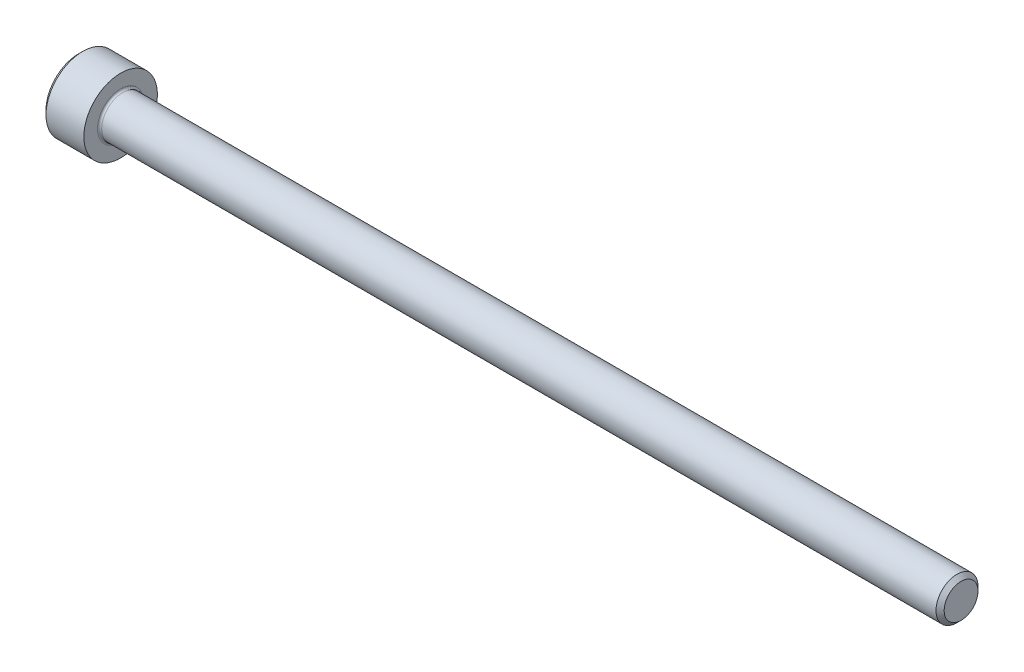
ISO-10303-21;
HEADER;
FILE_DESCRIPTION(('STEP AP214'),'2;1');
FILE_NAME('part.step','',(''),(''),'','','');
FILE_SCHEMA(('AUTOMOTIVE_DESIGN { 1 0 10303 214 1 1 1 1 }'));
ENDSEC;
DATA;
#1=APPLICATION_CONTEXT('core data for automotive mechanical design processes');
#2=APPLICATION_PROTOCOL_DEFINITION('international standard','automotive_design',2000,#1);
#3=PRODUCT_CONTEXT('',#1,'mechanical');
#4=PRODUCT('Part','Part','',(#3));
#5=PRODUCT_RELATED_PRODUCT_CATEGORY('part','',(#4));
#6=PRODUCT_DEFINITION_FORMATION('','',#4);
#7=PRODUCT_DEFINITION_CONTEXT('part definition',#1,'design');
#8=PRODUCT_DEFINITION('design','',#6,#7);
#9=PRODUCT_DEFINITION_SHAPE('','',#8);
#10=(LENGTH_UNIT() NAMED_UNIT(*) SI_UNIT(.MILLI.,.METRE.));
#11=(NAMED_UNIT(*) PLANE_ANGLE_UNIT() SI_UNIT($,.RADIAN.));
#12=(NAMED_UNIT(*) SI_UNIT($,.STERADIAN.) SOLID_ANGLE_UNIT());
#13=UNCERTAINTY_MEASURE_WITH_UNIT(LENGTH_MEASURE(1.E-05),#10,'distance_accuracy_value','');
#14=(GEOMETRIC_REPRESENTATION_CONTEXT(3) GLOBAL_UNCERTAINTY_ASSIGNED_CONTEXT((#13)) GLOBAL_UNIT_ASSIGNED_CONTEXT((#10,
#11,#12)) REPRESENTATION_CONTEXT('',''));
#15=CARTESIAN_POINT('',(0.,0.,0.));
#16=DIRECTION('',(0.,0.,1.));
#17=DIRECTION('',(1.,0.,0.));
#18=AXIS2_PLACEMENT_3D('',#15,#16,#17);
#19=CARTESIAN_POINT('',(0.,0.,0.));
#20=DIRECTION('',(-1.,0.,0.));
#21=DIRECTION('',(0.,0.,1.));
#22=AXIS2_PLACEMENT_3D('',#19,#20,#21);
#23=PLANE('',#22);
#24=DIRECTION('',(0.,-0.500000000000001,0.866025403784438));
#25=VECTOR('',#24,1.);
#26=CARTESIAN_POINT('',(0.,1.77304267668134,0.));
#27=LINE('',#26,#25);
#28=CARTESIAN_POINT('',(0.,1.77304267668134,0.));
#29=VERTEX_POINT('',#28);
#30=CARTESIAN_POINT('',(0.,0.886521338340669,1.5355));
#31=VERTEX_POINT('',#30);
#32=EDGE_CURVE('E388',#29,#31,#27,.T.);
#33=ORIENTED_EDGE('',*,*,#32,.T.);
#34=DIRECTION('',(0.,1.,0.));
#35=VECTOR('',#34,1.);
#36=CARTESIAN_POINT('',(0.,-0.886521338340673,1.5355));
#37=LINE('',#36,#35);
#38=CARTESIAN_POINT('',(0.,-0.886521338340673,1.5355));
#39=VERTEX_POINT('',#38);
#40=EDGE_CURVE('E137',#39,#31,#37,.T.);
#41=ORIENTED_EDGE('',*,*,#40,.F.);
#42=DIRECTION('',(0.,-0.500000000000001,-0.866025403784438));
#43=VECTOR('',#42,1.);
#44=CARTESIAN_POINT('',(0.,-0.886521338340673,1.5355));
#45=LINE('',#44,#43);
#46=CARTESIAN_POINT('',(0.,-1.77304267668135,0.));
#47=VERTEX_POINT('',#46);
#48=EDGE_CURVE('E391',#39,#47,#45,.T.);
#49=ORIENTED_EDGE('',*,*,#48,.T.);
#50=DIRECTION('',(0.,0.500000000000001,-0.866025403784438));
#51=VECTOR('',#50,1.);
#52=CARTESIAN_POINT('',(0.,-1.77304267668135,0.));
#53=LINE('',#52,#51);
#54=CARTESIAN_POINT('',(0.,-0.886521338340674,-1.5355));
#55=VERTEX_POINT('',#54);
#56=EDGE_CURVE('E394',#47,#55,#53,.T.);
#57=ORIENTED_EDGE('',*,*,#56,.T.);
#58=DIRECTION('',(0.,-1.,0.));
#59=VECTOR('',#58,1.);
#60=CARTESIAN_POINT('',(0.,0.886521338340669,-1.5355));
#61=LINE('',#60,#59);
#62=CARTESIAN_POINT('',(0.,0.886521338340669,-1.5355));
#63=VERTEX_POINT('',#62);
#64=EDGE_CURVE('E397',#63,#55,#61,.T.);
#65=ORIENTED_EDGE('',*,*,#64,.F.);
#66=DIRECTION('',(0.,-0.500000000000001,-0.866025403784438));
#67=VECTOR('',#66,1.);
#68=CARTESIAN_POINT('',(0.,1.77304267668134,0.));
#69=LINE('',#68,#67);
#70=EDGE_CURVE('E132',#29,#63,#69,.T.);
#71=ORIENTED_EDGE('',*,*,#70,.F.);
#72=EDGE_LOOP('',(#33,#41,#49,#57,#65,#71));
#73=FACE_BOUND('',#72,.T.);
#74=CARTESIAN_POINT('',(0.,0.,0.));
#75=DIRECTION('',(-1.,0.,0.));
#76=DIRECTION('',(0.,0.,1.));
#77=AXIS2_PLACEMENT_3D('',#74,#75,#76);
#78=CIRCLE('',#77,3.1);
#79=CARTESIAN_POINT('',(0.,0.,3.1));
#80=VERTEX_POINT('',#79);
#81=EDGE_CURVE('E148',#80,#80,#78,.T.);
#82=ORIENTED_EDGE('',*,*,#81,.T.);
#83=EDGE_LOOP('',(#82));
#84=FACE_BOUND('',#83,.T.);
#85=ADVANCED_FACE('F41',(#73,#84),#23,.T.);
#86=CARTESIAN_POINT('',(84.,1.61,0.));
#87=DIRECTION('',(1.,0.,0.));
#88=DIRECTION('',(0.,0.,-1.));
#89=AXIS2_PLACEMENT_3D('',#86,#87,#88);
#90=PLANE('',#89);
#91=CARTESIAN_POINT('',(84.,0.,0.));
#92=DIRECTION('',(-1.,0.,0.));
#93=DIRECTION('',(0.,0.,1.));
#94=AXIS2_PLACEMENT_3D('',#91,#92,#93);
#95=CIRCLE('',#94,1.61);
#96=CARTESIAN_POINT('',(84.,0.,1.61));
#97=VERTEX_POINT('',#96);
#98=EDGE_CURVE('E161',#97,#97,#95,.T.);
#99=ORIENTED_EDGE('',*,*,#98,.F.);
#100=EDGE_LOOP('',(#99));
#101=FACE_BOUND('',#100,.T.);
#102=ADVANCED_FACE('F183',(#101),#90,.T.);
#103=CARTESIAN_POINT('',(84.,0.,0.));
#104=DIRECTION('',(-1.,0.,0.));
#105=DIRECTION('',(0.,0.,1.));
#106=AXIS2_PLACEMENT_3D('',#103,#104,#105);
#107=CONICAL_SURFACE('',#106,1.61,0.785398163397544);
#108=CARTESIAN_POINT('',(83.6100000000001,0.,0.));
#109=DIRECTION('',(-1.,0.,0.));
#110=DIRECTION('',(0.,0.,1.));
#111=AXIS2_PLACEMENT_3D('',#108,#109,#110);
#112=CIRCLE('',#111,2.00000000000002);
#113=CARTESIAN_POINT('',(83.6100000000001,0.,2.00000000000002));
#114=VERTEX_POINT('',#113);
#115=EDGE_CURVE('E158',#114,#114,#112,.T.);
#116=ORIENTED_EDGE('',*,*,#115,.F.);
#117=EDGE_LOOP('',(#116));
#118=FACE_BOUND('',#117,.T.);
#119=ORIENTED_EDGE('',*,*,#98,.T.);
#120=EDGE_LOOP('',(#119));
#121=FACE_BOUND('',#120,.T.);
#122=ADVANCED_FACE('F189',(#118,#121),#107,.T.);
#123=CARTESIAN_POINT('',(-31.75,0.,0.));
#124=DIRECTION('',(-1.,0.,0.));
#125=DIRECTION('',(0.,0.,1.));
#126=AXIS2_PLACEMENT_3D('',#123,#124,#125);
#127=CYLINDRICAL_SURFACE('',#126,2.00000000000001);
#128=CARTESIAN_POINT('',(4.2,0.,0.));
#129=DIRECTION('',(1.,0.,0.));
#130=DIRECTION('',(0.,0.,-1.));
#131=AXIS2_PLACEMENT_3D('',#128,#129,#130);
#132=CIRCLE('',#131,2.00000000000001);
#133=CARTESIAN_POINT('',(4.2,0.,-2.00000000000001));
#134=VERTEX_POINT('',#133);
#135=EDGE_CURVE('E11',#134,#134,#132,.T.);
#136=ORIENTED_EDGE('',*,*,#135,.T.);
#137=EDGE_LOOP('',(#136));
#138=FACE_BOUND('',#137,.T.);
#139=ORIENTED_EDGE('',*,*,#115,.T.);
#140=EDGE_LOOP('',(#139));
#141=FACE_BOUND('',#140,.T.);
#142=ADVANCED_FACE('F199',(#138,#141),#127,.T.);
#143=CARTESIAN_POINT('',(4.,3.5,0.));
#144=DIRECTION('',(1.,0.,0.));
#145=DIRECTION('',(0.,0.,-1.));
#146=AXIS2_PLACEMENT_3D('',#143,#144,#145);
#147=PLANE('',#146);
#148=CARTESIAN_POINT('',(4.,0.,0.));
#149=DIRECTION('',(1.,0.,0.));
#150=DIRECTION('',(0.,0.,-1.));
#151=AXIS2_PLACEMENT_3D('',#148,#149,#150);
#152=CIRCLE('',#151,2.20000000000001);
#153=CARTESIAN_POINT('',(4.,0.,-2.20000000000001));
#154=VERTEX_POINT('',#153);
#155=EDGE_CURVE('E49',#154,#154,#152,.F.);
#156=ORIENTED_EDGE('',*,*,#155,.T.);
#157=EDGE_LOOP('',(#156));
#158=FACE_BOUND('',#157,.T.);
#159=CARTESIAN_POINT('',(4.,0.,0.));
#160=DIRECTION('',(-1.,0.,0.));
#161=DIRECTION('',(0.,0.,1.));
#162=AXIS2_PLACEMENT_3D('',#159,#160,#161);
#163=CIRCLE('',#162,3.5);
#164=CARTESIAN_POINT('',(4.,0.,3.5));
#165=VERTEX_POINT('',#164);
#166=EDGE_CURVE('E155',#165,#165,#163,.T.);
#167=ORIENTED_EDGE('',*,*,#166,.F.);
#168=EDGE_LOOP('',(#167));
#169=FACE_BOUND('',#168,.T.);
#170=ADVANCED_FACE('F166',(#158,#169),#147,.T.);
#171=CARTESIAN_POINT('',(-31.75,0.,0.));
#172=DIRECTION('',(-1.,0.,0.));
#173=DIRECTION('',(0.,0.,1.));
#174=AXIS2_PLACEMENT_3D('',#171,#172,#173);
#175=CYLINDRICAL_SURFACE('',#174,3.5);
#176=ORIENTED_EDGE('',*,*,#166,.T.);
#177=EDGE_LOOP('',(#176));
#178=FACE_BOUND('',#177,.T.);
#179=CARTESIAN_POINT('',(0.399999999999998,0.,0.));
#180=DIRECTION('',(-1.,0.,0.));
#181=DIRECTION('',(0.,0.,1.));
#182=AXIS2_PLACEMENT_3D('',#179,#180,#181);
#183=CIRCLE('',#182,3.5);
#184=CARTESIAN_POINT('',(0.399999999999998,0.,3.5));
#185=VERTEX_POINT('',#184);
#186=EDGE_CURVE('E152',#185,#185,#183,.T.);
#187=ORIENTED_EDGE('',*,*,#186,.F.);
#188=EDGE_LOOP('',(#187));
#189=FACE_BOUND('',#188,.T.);
#190=ADVANCED_FACE('F179',(#178,#189),#175,.T.);
#191=CARTESIAN_POINT('',(0.,0.,0.));
#192=DIRECTION('',(1.,0.,0.));
#193=DIRECTION('',(0.,0.,-1.));
#194=AXIS2_PLACEMENT_3D('',#191,#192,#193);
#195=CONICAL_SURFACE('',#194,3.1,0.785398163397452);
#196=ORIENTED_EDGE('',*,*,#186,.T.);
#197=EDGE_LOOP('',(#196));
#198=FACE_BOUND('',#197,.T.);
#199=ORIENTED_EDGE('',*,*,#81,.F.);
#200=EDGE_LOOP('',(#199));
#201=FACE_BOUND('',#200,.T.);
#202=ADVANCED_FACE('F170',(#198,#201),#195,.T.);
#203=CARTESIAN_POINT('',(4.2,0.,0.));
#204=DIRECTION('',(1.,0.,0.));
#205=DIRECTION('',(0.,0.,-1.));
#206=AXIS2_PLACEMENT_3D('',#203,#204,#205);
#207=TOROIDAL_SURFACE('',#206,2.20000000000001,0.2);
#208=ORIENTED_EDGE('',*,*,#135,.F.);
#209=EDGE_LOOP('',(#208));
#210=FACE_BOUND('',#209,.T.);
#211=ORIENTED_EDGE('',*,*,#155,.F.);
#212=EDGE_LOOP('',(#211));
#213=FACE_BOUND('',#212,.T.);
#214=ADVANCED_FACE('F43',(#210,#213),#207,.F.);
#215=CARTESIAN_POINT('',(2.,1.77304267668134,0.));
#216=DIRECTION('',(0.,-0.866025403784438,-0.500000000000001));
#217=DIRECTION('',(0.,0.500000000000001,-0.866025403784438));
#218=AXIS2_PLACEMENT_3D('',#215,#216,#217);
#219=PLANE('',#218);
#220=ORIENTED_EDGE('',*,*,#32,.F.);
#221=DIRECTION('',(-1.,0.,0.));
#222=VECTOR('',#221,1.);
#223=CARTESIAN_POINT('',(2.,1.77304267668134,0.));
#224=LINE('',#223,#222);
#225=CARTESIAN_POINT('',(2.,1.77304267668134,0.));
#226=VERTEX_POINT('',#225);
#227=EDGE_CURVE('E378',#226,#29,#224,.T.);
#228=ORIENTED_EDGE('',*,*,#227,.F.);
#229=DIRECTION('',(0.,-0.500000000000001,0.866025403784438));
#230=VECTOR('',#229,1.);
#231=CARTESIAN_POINT('',(2.,1.77304267668134,0.));
#232=LINE('',#231,#230);
#233=CARTESIAN_POINT('',(2.,1.329782007511,0.767750000000001));
#234=VERTEX_POINT('',#233);
#235=EDGE_CURVE('E124',#226,#234,#232,.T.);
#236=ORIENTED_EDGE('',*,*,#235,.T.);
#237=CARTESIAN_POINT('',(2.,0.886521338340669,1.5355));
#238=VERTEX_POINT('',#237);
#239=EDGE_CURVE('E115',#234,#238,#232,.T.);
#240=ORIENTED_EDGE('',*,*,#239,.T.);
#241=DIRECTION('',(-1.,0.,0.));
#242=VECTOR('',#241,1.);
#243=CARTESIAN_POINT('',(2.,0.886521338340669,1.5355));
#244=LINE('',#243,#242);
#245=EDGE_CURVE('E129',#238,#31,#244,.T.);
#246=ORIENTED_EDGE('',*,*,#245,.T.);
#247=EDGE_LOOP('',(#220,#228,#236,#240,#246));
#248=FACE_BOUND('',#247,.T.);
#249=ADVANCED_FACE('F128',(#248),#219,.T.);
#250=CARTESIAN_POINT('',(2.,-0.886521338340673,1.5355));
#251=DIRECTION('',(0.,0.,1.));
#252=DIRECTION('',(0.,-1.,0.));
#253=AXIS2_PLACEMENT_3D('',#250,#251,#252);
#254=PLANE('',#253);
#255=ORIENTED_EDGE('',*,*,#40,.T.);
#256=ORIENTED_EDGE('',*,*,#245,.F.);
#257=DIRECTION('',(0.,1.,0.));
#258=VECTOR('',#257,1.);
#259=CARTESIAN_POINT('',(2.,-0.886521338340673,1.5355));
#260=LINE('',#259,#258);
#261=CARTESIAN_POINT('',(2.,0.,1.5355));
#262=VERTEX_POINT('',#261);
#263=EDGE_CURVE('E112',#262,#238,#260,.T.);
#264=ORIENTED_EDGE('',*,*,#263,.F.);
#265=CARTESIAN_POINT('',(2.,-0.886521338340673,1.5355));
#266=VERTEX_POINT('',#265);
#267=EDGE_CURVE('E123',#266,#262,#260,.T.);
#268=ORIENTED_EDGE('',*,*,#267,.F.);
#269=DIRECTION('',(-1.,0.,0.));
#270=VECTOR('',#269,1.);
#271=CARTESIAN_POINT('',(2.,-0.886521338340673,1.5355));
#272=LINE('',#271,#270);
#273=EDGE_CURVE('E139',#266,#39,#272,.T.);
#274=ORIENTED_EDGE('',*,*,#273,.T.);
#275=EDGE_LOOP('',(#255,#256,#264,#268,#274));
#276=FACE_BOUND('',#275,.T.);
#277=ADVANCED_FACE('F134',(#276),#254,.F.);
#278=CARTESIAN_POINT('',(2.,-0.886521338340673,1.5355));
#279=DIRECTION('',(0.,0.866025403784438,-0.500000000000001));
#280=DIRECTION('',(0.,0.500000000000001,0.866025403784438));
#281=AXIS2_PLACEMENT_3D('',#278,#279,#280);
#282=PLANE('',#281);
#283=ORIENTED_EDGE('',*,*,#48,.F.);
#284=ORIENTED_EDGE('',*,*,#273,.F.);
#285=DIRECTION('',(0.,-0.500000000000001,-0.866025403784438));
#286=VECTOR('',#285,1.);
#287=CARTESIAN_POINT('',(2.,-0.886521338340673,1.5355));
#288=LINE('',#287,#286);
#289=CARTESIAN_POINT('',(2.,-1.32978200751101,0.767750000000004));
#290=VERTEX_POINT('',#289);
#291=EDGE_CURVE('E417',#266,#290,#288,.T.);
#292=ORIENTED_EDGE('',*,*,#291,.T.);
#293=CARTESIAN_POINT('',(2.,-1.77304267668135,0.));
#294=VERTEX_POINT('',#293);
#295=EDGE_CURVE('E406',#290,#294,#288,.T.);
#296=ORIENTED_EDGE('',*,*,#295,.T.);
#297=DIRECTION('',(-1.,0.,0.));
#298=VECTOR('',#297,1.);
#299=CARTESIAN_POINT('',(2.,-1.77304267668135,0.));
#300=LINE('',#299,#298);
#301=EDGE_CURVE('E144',#294,#47,#300,.T.);
#302=ORIENTED_EDGE('',*,*,#301,.T.);
#303=EDGE_LOOP('',(#283,#284,#292,#296,#302));
#304=FACE_BOUND('',#303,.T.);
#305=ADVANCED_FACE('F267',(#304),#282,.T.);
#306=CARTESIAN_POINT('',(2.,-1.77304267668135,0.));
#307=DIRECTION('',(0.,0.866025403784438,0.500000000000001));
#308=DIRECTION('',(0.,-0.500000000000001,0.866025403784438));
#309=AXIS2_PLACEMENT_3D('',#306,#307,#308);
#310=PLANE('',#309);
#311=ORIENTED_EDGE('',*,*,#56,.F.);
#312=ORIENTED_EDGE('',*,*,#301,.F.);
#313=DIRECTION('',(0.,0.500000000000001,-0.866025403784438));
#314=VECTOR('',#313,1.);
#315=CARTESIAN_POINT('',(2.,-1.77304267668135,0.));
#316=LINE('',#315,#314);
#317=CARTESIAN_POINT('',(2.,-1.32978200751101,-0.767750000000003));
#318=VERTEX_POINT('',#317);
#319=EDGE_CURVE('E384',#294,#318,#316,.T.);
#320=ORIENTED_EDGE('',*,*,#319,.T.);
#321=CARTESIAN_POINT('',(2.,-0.886521338340674,-1.5355));
#322=VERTEX_POINT('',#321);
#323=EDGE_CURVE('E416',#318,#322,#316,.T.);
#324=ORIENTED_EDGE('',*,*,#323,.T.);
#325=DIRECTION('',(-1.,0.,0.));
#326=VECTOR('',#325,1.);
#327=CARTESIAN_POINT('',(2.,-0.886521338340674,-1.5355));
#328=LINE('',#327,#326);
#329=EDGE_CURVE('E377',#322,#55,#328,.T.);
#330=ORIENTED_EDGE('',*,*,#329,.T.);
#331=EDGE_LOOP('',(#311,#312,#320,#324,#330));
#332=FACE_BOUND('',#331,.T.);
#333=ADVANCED_FACE('F275',(#332),#310,.T.);
#334=CARTESIAN_POINT('',(2.,0.886521338340669,-1.5355));
#335=DIRECTION('',(0.,0.,-1.));
#336=DIRECTION('',(0.,1.,0.));
#337=AXIS2_PLACEMENT_3D('',#334,#335,#336);
#338=PLANE('',#337);
#339=ORIENTED_EDGE('',*,*,#64,.T.);
#340=ORIENTED_EDGE('',*,*,#329,.F.);
#341=DIRECTION('',(0.,-1.,0.));
#342=VECTOR('',#341,1.);
#343=CARTESIAN_POINT('',(2.,0.886521338340669,-1.5355));
#344=LINE('',#343,#342);
#345=CARTESIAN_POINT('',(2.,0.,-1.5355));
#346=VERTEX_POINT('',#345);
#347=EDGE_CURVE('E381',#346,#322,#344,.T.);
#348=ORIENTED_EDGE('',*,*,#347,.F.);
#349=CARTESIAN_POINT('',(2.,0.886521338340669,-1.5355));
#350=VERTEX_POINT('',#349);
#351=EDGE_CURVE('E56',#350,#346,#344,.T.);
#352=ORIENTED_EDGE('',*,*,#351,.F.);
#353=DIRECTION('',(-1.,0.,0.));
#354=VECTOR('',#353,1.);
#355=CARTESIAN_POINT('',(2.,0.886521338340669,-1.5355));
#356=LINE('',#355,#354);
#357=EDGE_CURVE('E374',#350,#63,#356,.T.);
#358=ORIENTED_EDGE('',*,*,#357,.T.);
#359=EDGE_LOOP('',(#339,#340,#348,#352,#358));
#360=FACE_BOUND('',#359,.T.);
#361=ADVANCED_FACE('F284',(#360),#338,.F.);
#362=CARTESIAN_POINT('',(2.,1.77304267668134,0.));
#363=DIRECTION('',(0.,0.866025403784438,-0.500000000000001));
#364=DIRECTION('',(0.,0.500000000000001,0.866025403784438));
#365=AXIS2_PLACEMENT_3D('',#362,#363,#364);
#366=PLANE('',#365);
#367=ORIENTED_EDGE('',*,*,#70,.T.);
#368=ORIENTED_EDGE('',*,*,#357,.F.);
#369=DIRECTION('',(0.,-0.500000000000001,-0.866025403784438));
#370=VECTOR('',#369,1.);
#371=CARTESIAN_POINT('',(2.,1.77304267668134,0.));
#372=LINE('',#371,#370);
#373=CARTESIAN_POINT('',(2.,1.329782007511,-0.767750000000002));
#374=VERTEX_POINT('',#373);
#375=EDGE_CURVE('E364',#374,#350,#372,.T.);
#376=ORIENTED_EDGE('',*,*,#375,.F.);
#377=EDGE_CURVE('E370',#226,#374,#372,.T.);
#378=ORIENTED_EDGE('',*,*,#377,.F.);
#379=ORIENTED_EDGE('',*,*,#227,.T.);
#380=EDGE_LOOP('',(#367,#368,#376,#378,#379));
#381=FACE_BOUND('',#380,.T.);
#382=ADVANCED_FACE('F293',(#381),#366,.F.);
#383=CARTESIAN_POINT('',(2.,1.77304267668134,0.));
#384=DIRECTION('',(1.,0.,0.));
#385=DIRECTION('',(0.,0.,-1.));
#386=AXIS2_PLACEMENT_3D('',#383,#384,#385);
#387=PLANE('',#386);
#388=ORIENTED_EDGE('',*,*,#347,.T.);
#389=ORIENTED_EDGE('',*,*,#323,.F.);
#390=CARTESIAN_POINT('',(2.,0.,0.));
#391=DIRECTION('',(-1.,0.,0.));
#392=DIRECTION('',(0.,0.,1.));
#393=AXIS2_PLACEMENT_3D('',#390,#391,#392);
#394=CIRCLE('',#393,1.5355);
#395=EDGE_CURVE('E412',#346,#318,#394,.T.);
#396=ORIENTED_EDGE('',*,*,#395,.F.);
#397=EDGE_LOOP('',(#388,#389,#396));
#398=FACE_BOUND('',#397,.T.);
#399=ADVANCED_FACE('F302',(#398),#387,.F.);
#400=ORIENTED_EDGE('',*,*,#319,.F.);
#401=ORIENTED_EDGE('',*,*,#295,.F.);
#402=EDGE_CURVE('E142',#318,#290,#394,.T.);
#403=ORIENTED_EDGE('',*,*,#402,.F.);
#404=EDGE_LOOP('',(#400,#401,#403));
#405=FACE_BOUND('',#404,.T.);
#406=ADVANCED_FACE('F311',(#405),#387,.F.);
#407=ORIENTED_EDGE('',*,*,#291,.F.);
#408=ORIENTED_EDGE('',*,*,#267,.T.);
#409=EDGE_CURVE('E138',#290,#262,#394,.T.);
#410=ORIENTED_EDGE('',*,*,#409,.F.);
#411=EDGE_LOOP('',(#407,#408,#410));
#412=FACE_BOUND('',#411,.T.);
#413=ADVANCED_FACE('F320',(#412),#387,.F.);
#414=ORIENTED_EDGE('',*,*,#263,.T.);
#415=ORIENTED_EDGE('',*,*,#239,.F.);
#416=EDGE_CURVE('E118',#262,#234,#394,.T.);
#417=ORIENTED_EDGE('',*,*,#416,.F.);
#418=EDGE_LOOP('',(#414,#415,#417));
#419=FACE_BOUND('',#418,.T.);
#420=ADVANCED_FACE('F114',(#419),#387,.F.);
#421=ORIENTED_EDGE('',*,*,#235,.F.);
#422=ORIENTED_EDGE('',*,*,#377,.T.);
#423=EDGE_CURVE('E149',#234,#374,#394,.T.);
#424=ORIENTED_EDGE('',*,*,#423,.F.);
#425=EDGE_LOOP('',(#421,#422,#424));
#426=FACE_BOUND('',#425,.T.);
#427=ADVANCED_FACE('F335',(#426),#387,.F.);
#428=ORIENTED_EDGE('',*,*,#375,.T.);
#429=ORIENTED_EDGE('',*,*,#351,.T.);
#430=EDGE_CURVE('E367',#374,#346,#394,.T.);
#431=ORIENTED_EDGE('',*,*,#430,.F.);
#432=EDGE_LOOP('',(#428,#429,#431));
#433=FACE_BOUND('',#432,.T.);
#434=ADVANCED_FACE('F250',(#433),#387,.F.);
#435=CARTESIAN_POINT('',(2.,0.,0.));
#436=DIRECTION('',(-1.,0.,0.));
#437=DIRECTION('',(0.,0.,1.));
#438=AXIS2_PLACEMENT_3D('',#435,#436,#437);
#439=CONICAL_SURFACE('',#438,1.5355,1.04719755119659);
#440=CARTESIAN_POINT('',(2.88652133834068,0.,0.));
#441=VERTEX_POINT('',#440);
#442=VERTEX_LOOP('',#441);
#443=FACE_BOUND('',#442,.T.);
#444=ORIENTED_EDGE('',*,*,#416,.T.);
#445=ORIENTED_EDGE('',*,*,#423,.T.);
#446=ORIENTED_EDGE('',*,*,#430,.T.);
#447=ORIENTED_EDGE('',*,*,#395,.T.);
#448=ORIENTED_EDGE('',*,*,#402,.T.);
#449=ORIENTED_EDGE('',*,*,#409,.T.);
#450=EDGE_LOOP('',(#444,#445,#446,#447,#448,#449));
#451=FACE_BOUND('',#450,.T.);
#452=ADVANCED_FACE('F193',(#443,#451),#439,.F.);
#453=CLOSED_SHELL('',(#85,#102,#122,#142,#170,#190,#202,#214,#249,#277,#305,#333,#361,#382,#399,
#406,#413,#420,#427,#434,#452));
#454=MANIFOLD_SOLID_BREP('B2',#453);
#455=ADVANCED_BREP_SHAPE_REPRESENTATION('',(#18,#454),#14);
#456=SHAPE_DEFINITION_REPRESENTATION(#9,#455);
ENDSEC;
END-ISO-10303-21;
